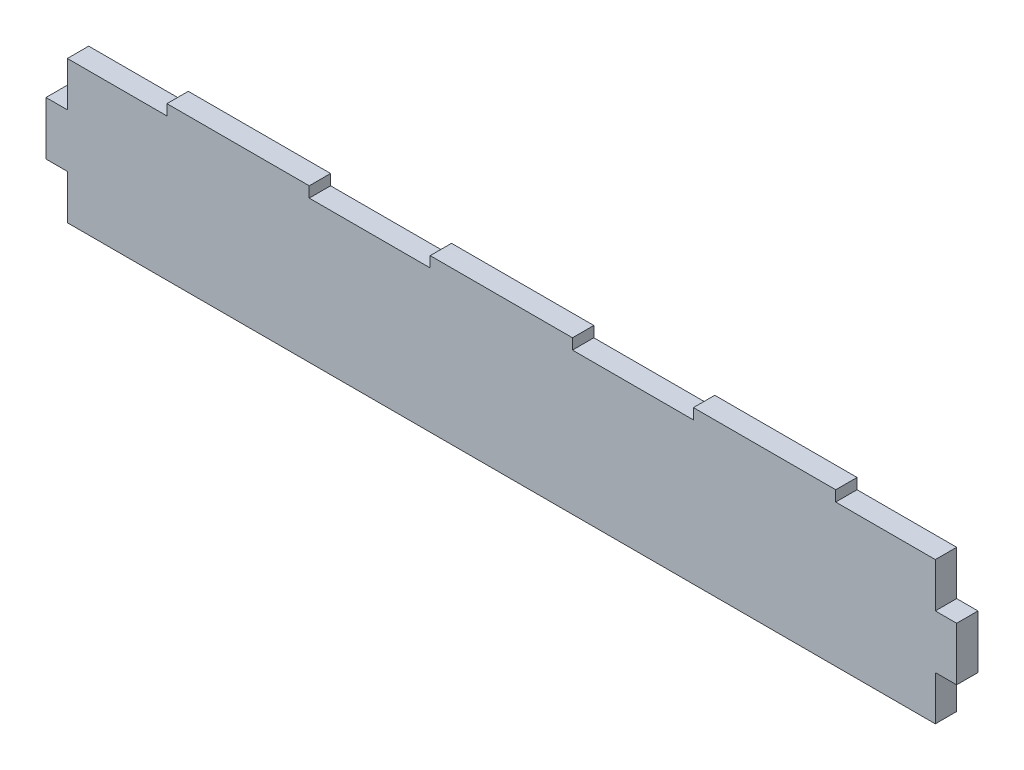
ISO-10303-21;
HEADER;
FILE_DESCRIPTION(('STEP AP214'),'2;1');
FILE_NAME('part.step','',(''),(''),'','','');
FILE_SCHEMA(('AUTOMOTIVE_DESIGN { 1 0 10303 214 1 1 1 1 }'));
ENDSEC;
DATA;
#1=APPLICATION_CONTEXT('core data for automotive mechanical design processes');
#2=APPLICATION_PROTOCOL_DEFINITION('international standard','automotive_design',2000,#1);
#3=PRODUCT_CONTEXT('',#1,'mechanical');
#4=PRODUCT('Part','Part','',(#3));
#5=PRODUCT_RELATED_PRODUCT_CATEGORY('part','',(#4));
#6=PRODUCT_DEFINITION_FORMATION('','',#4);
#7=PRODUCT_DEFINITION_CONTEXT('part definition',#1,'design');
#8=PRODUCT_DEFINITION('design','',#6,#7);
#9=PRODUCT_DEFINITION_SHAPE('','',#8);
#10=(LENGTH_UNIT() NAMED_UNIT(*) SI_UNIT(.MILLI.,.METRE.));
#11=(NAMED_UNIT(*) PLANE_ANGLE_UNIT() SI_UNIT($,.RADIAN.));
#12=(NAMED_UNIT(*) SI_UNIT($,.STERADIAN.) SOLID_ANGLE_UNIT());
#13=UNCERTAINTY_MEASURE_WITH_UNIT(LENGTH_MEASURE(1.E-05),#10,'distance_accuracy_value','');
#14=(GEOMETRIC_REPRESENTATION_CONTEXT(3) GLOBAL_UNCERTAINTY_ASSIGNED_CONTEXT((#13)) GLOBAL_UNIT_ASSIGNED_CONTEXT((#10,
#11,#12)) REPRESENTATION_CONTEXT('',''));
#15=CARTESIAN_POINT('',(0.,0.,0.));
#16=DIRECTION('',(0.,0.,1.));
#17=DIRECTION('',(1.,0.,0.));
#18=AXIS2_PLACEMENT_3D('',#15,#16,#17);
#19=CARTESIAN_POINT('',(0.,0.,6.));
#20=DIRECTION('',(1.,0.,0.));
#21=DIRECTION('',(0.,0.,-1.));
#22=AXIS2_PLACEMENT_3D('',#19,#20,#21);
#23=PLANE('',#22);
#24=DIRECTION('',(0.,-1.,0.));
#25=VECTOR('',#24,1.);
#26=CARTESIAN_POINT('',(0.,0.,0.));
#27=LINE('',#26,#25);
#28=CARTESIAN_POINT('',(0.,12.5,0.));
#29=VERTEX_POINT('',#28);
#30=CARTESIAN_POINT('',(0.,0.,0.));
#31=VERTEX_POINT('',#30);
#32=EDGE_CURVE('E225',#29,#31,#27,.T.);
#33=ORIENTED_EDGE('',*,*,#32,.T.);
#34=DIRECTION('',(0.,0.,-1.));
#35=VECTOR('',#34,1.);
#36=CARTESIAN_POINT('',(0.,0.,6.));
#37=LINE('',#36,#35);
#38=CARTESIAN_POINT('',(0.,0.,6.));
#39=VERTEX_POINT('',#38);
#40=EDGE_CURVE('E11',#39,#31,#37,.T.);
#41=ORIENTED_EDGE('',*,*,#40,.F.);
#42=DIRECTION('',(0.,-1.,0.));
#43=VECTOR('',#42,1.);
#44=CARTESIAN_POINT('',(0.,0.,6.));
#45=LINE('',#44,#43);
#46=CARTESIAN_POINT('',(0.,12.5,6.));
#47=VERTEX_POINT('',#46);
#48=EDGE_CURVE('E271',#47,#39,#45,.T.);
#49=ORIENTED_EDGE('',*,*,#48,.F.);
#50=DIRECTION('',(0.,0.,-1.));
#51=VECTOR('',#50,1.);
#52=CARTESIAN_POINT('',(0.,12.5,6.));
#53=LINE('',#52,#51);
#54=EDGE_CURVE('E221',#47,#29,#53,.T.);
#55=ORIENTED_EDGE('',*,*,#54,.T.);
#56=EDGE_LOOP('',(#33,#41,#49,#55));
#57=FACE_BOUND('',#56,.T.);
#58=ADVANCED_FACE('F33',(#57),#23,.F.);
#59=CARTESIAN_POINT('',(0.,0.,6.));
#60=DIRECTION('',(0.,1.,0.));
#61=DIRECTION('',(0.,0.,1.));
#62=AXIS2_PLACEMENT_3D('',#59,#60,#61);
#63=PLANE('',#62);
#64=DIRECTION('',(1.,0.,0.));
#65=VECTOR('',#64,1.);
#66=CARTESIAN_POINT('',(0.,0.,0.));
#67=LINE('',#66,#65);
#68=CARTESIAN_POINT('',(244.,0.,0.));
#69=VERTEX_POINT('',#68);
#70=EDGE_CURVE('E228',#31,#69,#67,.T.);
#71=ORIENTED_EDGE('',*,*,#70,.T.);
#72=DIRECTION('',(0.,0.,-1.));
#73=VECTOR('',#72,1.);
#74=CARTESIAN_POINT('',(244.,0.,6.));
#75=LINE('',#74,#73);
#76=CARTESIAN_POINT('',(244.,0.,6.));
#77=VERTEX_POINT('',#76);
#78=EDGE_CURVE('E41',#77,#69,#75,.T.);
#79=ORIENTED_EDGE('',*,*,#78,.F.);
#80=DIRECTION('',(1.,0.,0.));
#81=VECTOR('',#80,1.);
#82=CARTESIAN_POINT('',(0.,0.,6.));
#83=LINE('',#82,#81);
#84=EDGE_CURVE('E140',#39,#77,#83,.T.);
#85=ORIENTED_EDGE('',*,*,#84,.F.);
#86=ORIENTED_EDGE('',*,*,#40,.T.);
#87=EDGE_LOOP('',(#71,#79,#85,#86));
#88=FACE_BOUND('',#87,.T.);
#89=ADVANCED_FACE('F409',(#88),#63,.F.);
#90=CARTESIAN_POINT('',(244.,0.,6.));
#91=DIRECTION('',(-1.,0.,0.));
#92=DIRECTION('',(0.,0.,1.));
#93=AXIS2_PLACEMENT_3D('',#90,#91,#92);
#94=PLANE('',#93);
#95=DIRECTION('',(0.,1.,0.));
#96=VECTOR('',#95,1.);
#97=CARTESIAN_POINT('',(244.,0.,0.));
#98=LINE('',#97,#96);
#99=CARTESIAN_POINT('',(244.,12.5,0.));
#100=VERTEX_POINT('',#99);
#101=EDGE_CURVE('E230',#69,#100,#98,.T.);
#102=ORIENTED_EDGE('',*,*,#101,.T.);
#103=DIRECTION('',(0.,0.,-1.));
#104=VECTOR('',#103,1.);
#105=CARTESIAN_POINT('',(244.,12.5,6.));
#106=LINE('',#105,#104);
#107=CARTESIAN_POINT('',(244.,12.5,6.));
#108=VERTEX_POINT('',#107);
#109=EDGE_CURVE('E326',#108,#100,#106,.T.);
#110=ORIENTED_EDGE('',*,*,#109,.F.);
#111=DIRECTION('',(0.,1.,0.));
#112=VECTOR('',#111,1.);
#113=CARTESIAN_POINT('',(244.,0.,6.));
#114=LINE('',#113,#112);
#115=EDGE_CURVE('E334',#77,#108,#114,.T.);
#116=ORIENTED_EDGE('',*,*,#115,.F.);
#117=ORIENTED_EDGE('',*,*,#78,.T.);
#118=EDGE_LOOP('',(#102,#110,#116,#117));
#119=FACE_BOUND('',#118,.T.);
#120=ADVANCED_FACE('F332',(#119),#94,.F.);
#121=CARTESIAN_POINT('',(244.,12.5,6.));
#122=DIRECTION('',(0.,1.,0.));
#123=DIRECTION('',(0.,0.,1.));
#124=AXIS2_PLACEMENT_3D('',#121,#122,#123);
#125=PLANE('',#124);
#126=DIRECTION('',(1.,0.,0.));
#127=VECTOR('',#126,1.);
#128=CARTESIAN_POINT('',(244.,12.5,0.));
#129=LINE('',#128,#127);
#130=CARTESIAN_POINT('',(250.,12.5,0.));
#131=VERTEX_POINT('',#130);
#132=EDGE_CURVE('E232',#100,#131,#129,.T.);
#133=ORIENTED_EDGE('',*,*,#132,.T.);
#134=DIRECTION('',(0.,0.,-1.));
#135=VECTOR('',#134,1.);
#136=CARTESIAN_POINT('',(250.,12.5,6.));
#137=LINE('',#136,#135);
#138=CARTESIAN_POINT('',(250.,12.5,6.));
#139=VERTEX_POINT('',#138);
#140=EDGE_CURVE('E323',#139,#131,#137,.T.);
#141=ORIENTED_EDGE('',*,*,#140,.F.);
#142=DIRECTION('',(1.,0.,0.));
#143=VECTOR('',#142,1.);
#144=CARTESIAN_POINT('',(244.,12.5,6.));
#145=LINE('',#144,#143);
#146=EDGE_CURVE('E352',#108,#139,#145,.T.);
#147=ORIENTED_EDGE('',*,*,#146,.F.);
#148=ORIENTED_EDGE('',*,*,#109,.T.);
#149=EDGE_LOOP('',(#133,#141,#147,#148));
#150=FACE_BOUND('',#149,.T.);
#151=ADVANCED_FACE('F343',(#150),#125,.F.);
#152=CARTESIAN_POINT('',(250.,27.5,6.));
#153=DIRECTION('',(-1.,0.,0.));
#154=DIRECTION('',(0.,0.,1.));
#155=AXIS2_PLACEMENT_3D('',#152,#153,#154);
#156=PLANE('',#155);
#157=DIRECTION('',(0.,1.,0.));
#158=VECTOR('',#157,1.);
#159=CARTESIAN_POINT('',(250.,27.5,0.));
#160=LINE('',#159,#158);
#161=CARTESIAN_POINT('',(250.,27.5,0.));
#162=VERTEX_POINT('',#161);
#163=EDGE_CURVE('E234',#131,#162,#160,.T.);
#164=ORIENTED_EDGE('',*,*,#163,.T.);
#165=DIRECTION('',(0.,0.,-1.));
#166=VECTOR('',#165,1.);
#167=CARTESIAN_POINT('',(250.,27.5,6.));
#168=LINE('',#167,#166);
#169=CARTESIAN_POINT('',(250.,27.5,6.));
#170=VERTEX_POINT('',#169);
#171=EDGE_CURVE('E320',#170,#162,#168,.T.);
#172=ORIENTED_EDGE('',*,*,#171,.F.);
#173=DIRECTION('',(0.,1.,0.));
#174=VECTOR('',#173,1.);
#175=CARTESIAN_POINT('',(250.,27.5,6.));
#176=LINE('',#175,#174);
#177=EDGE_CURVE('E349',#139,#170,#176,.T.);
#178=ORIENTED_EDGE('',*,*,#177,.F.);
#179=ORIENTED_EDGE('',*,*,#140,.T.);
#180=EDGE_LOOP('',(#164,#172,#178,#179));
#181=FACE_BOUND('',#180,.T.);
#182=ADVANCED_FACE('F347',(#181),#156,.F.);
#183=CARTESIAN_POINT('',(244.,27.5,6.));
#184=DIRECTION('',(0.,-1.,0.));
#185=DIRECTION('',(0.,0.,-1.));
#186=AXIS2_PLACEMENT_3D('',#183,#184,#185);
#187=PLANE('',#186);
#188=DIRECTION('',(-1.,0.,0.));
#189=VECTOR('',#188,1.);
#190=CARTESIAN_POINT('',(244.,27.5,0.));
#191=LINE('',#190,#189);
#192=CARTESIAN_POINT('',(244.,27.5,0.));
#193=VERTEX_POINT('',#192);
#194=EDGE_CURVE('E236',#162,#193,#191,.T.);
#195=ORIENTED_EDGE('',*,*,#194,.T.);
#196=DIRECTION('',(0.,0.,-1.));
#197=VECTOR('',#196,1.);
#198=CARTESIAN_POINT('',(244.,27.5,6.));
#199=LINE('',#198,#197);
#200=CARTESIAN_POINT('',(244.,27.5,6.));
#201=VERTEX_POINT('',#200);
#202=EDGE_CURVE('E317',#201,#193,#199,.T.);
#203=ORIENTED_EDGE('',*,*,#202,.F.);
#204=DIRECTION('',(-1.,0.,0.));
#205=VECTOR('',#204,1.);
#206=CARTESIAN_POINT('',(244.,27.5,6.));
#207=LINE('',#206,#205);
#208=EDGE_CURVE('E351',#170,#201,#207,.T.);
#209=ORIENTED_EDGE('',*,*,#208,.F.);
#210=ORIENTED_EDGE('',*,*,#171,.T.);
#211=EDGE_LOOP('',(#195,#203,#209,#210));
#212=FACE_BOUND('',#211,.T.);
#213=ADVANCED_FACE('F422',(#212),#187,.F.);
#214=CARTESIAN_POINT('',(244.,27.5,6.));
#215=DIRECTION('',(-1.,0.,0.));
#216=DIRECTION('',(0.,0.,1.));
#217=AXIS2_PLACEMENT_3D('',#214,#215,#216);
#218=PLANE('',#217);
#219=DIRECTION('',(0.,1.,0.));
#220=VECTOR('',#219,1.);
#221=CARTESIAN_POINT('',(244.,27.5,0.));
#222=LINE('',#221,#220);
#223=CARTESIAN_POINT('',(244.,40.,0.));
#224=VERTEX_POINT('',#223);
#225=EDGE_CURVE('E238',#193,#224,#222,.T.);
#226=ORIENTED_EDGE('',*,*,#225,.T.);
#227=DIRECTION('',(0.,0.,-1.));
#228=VECTOR('',#227,1.);
#229=CARTESIAN_POINT('',(244.,40.,6.));
#230=LINE('',#229,#228);
#231=CARTESIAN_POINT('',(244.,40.,6.));
#232=VERTEX_POINT('',#231);
#233=EDGE_CURVE('E314',#232,#224,#230,.T.);
#234=ORIENTED_EDGE('',*,*,#233,.F.);
#235=DIRECTION('',(0.,1.,0.));
#236=VECTOR('',#235,1.);
#237=CARTESIAN_POINT('',(244.,27.5,6.));
#238=LINE('',#237,#236);
#239=EDGE_CURVE('E354',#201,#232,#238,.T.);
#240=ORIENTED_EDGE('',*,*,#239,.F.);
#241=ORIENTED_EDGE('',*,*,#202,.T.);
#242=EDGE_LOOP('',(#226,#234,#240,#241));
#243=FACE_BOUND('',#242,.T.);
#244=ADVANCED_FACE('F425',(#243),#218,.F.);
#245=CARTESIAN_POINT('',(216.,40.,6.));
#246=DIRECTION('',(0.,-1.,0.));
#247=DIRECTION('',(0.,0.,-1.));
#248=AXIS2_PLACEMENT_3D('',#245,#246,#247);
#249=PLANE('',#248);
#250=DIRECTION('',(-1.,0.,0.));
#251=VECTOR('',#250,1.);
#252=CARTESIAN_POINT('',(216.,40.,0.));
#253=LINE('',#252,#251);
#254=CARTESIAN_POINT('',(216.,40.,0.));
#255=VERTEX_POINT('',#254);
#256=EDGE_CURVE('E240',#224,#255,#253,.T.);
#257=ORIENTED_EDGE('',*,*,#256,.T.);
#258=DIRECTION('',(0.,0.,-1.));
#259=VECTOR('',#258,1.);
#260=CARTESIAN_POINT('',(216.,40.,6.));
#261=LINE('',#260,#259);
#262=CARTESIAN_POINT('',(216.,40.,6.));
#263=VERTEX_POINT('',#262);
#264=EDGE_CURVE('E311',#263,#255,#261,.T.);
#265=ORIENTED_EDGE('',*,*,#264,.F.);
#266=DIRECTION('',(-1.,0.,0.));
#267=VECTOR('',#266,1.);
#268=CARTESIAN_POINT('',(216.,40.,6.));
#269=LINE('',#268,#267);
#270=EDGE_CURVE('E360',#232,#263,#269,.T.);
#271=ORIENTED_EDGE('',*,*,#270,.F.);
#272=ORIENTED_EDGE('',*,*,#233,.T.);
#273=EDGE_LOOP('',(#257,#265,#271,#272));
#274=FACE_BOUND('',#273,.T.);
#275=ADVANCED_FACE('F429',(#274),#249,.F.);
#276=CARTESIAN_POINT('',(216.,40.,6.));
#277=DIRECTION('',(-1.,0.,0.));
#278=DIRECTION('',(0.,0.,1.));
#279=AXIS2_PLACEMENT_3D('',#276,#277,#278);
#280=PLANE('',#279);
#281=DIRECTION('',(0.,1.,0.));
#282=VECTOR('',#281,1.);
#283=CARTESIAN_POINT('',(216.,40.,0.));
#284=LINE('',#283,#282);
#285=CARTESIAN_POINT('',(216.,43.,0.));
#286=VERTEX_POINT('',#285);
#287=EDGE_CURVE('E242',#255,#286,#284,.T.);
#288=ORIENTED_EDGE('',*,*,#287,.T.);
#289=DIRECTION('',(0.,0.,-1.));
#290=VECTOR('',#289,1.);
#291=CARTESIAN_POINT('',(216.,43.,6.));
#292=LINE('',#291,#290);
#293=CARTESIAN_POINT('',(216.,43.,6.));
#294=VERTEX_POINT('',#293);
#295=EDGE_CURVE('E308',#294,#286,#292,.T.);
#296=ORIENTED_EDGE('',*,*,#295,.F.);
#297=DIRECTION('',(0.,1.,0.));
#298=VECTOR('',#297,1.);
#299=CARTESIAN_POINT('',(216.,40.,6.));
#300=LINE('',#299,#298);
#301=EDGE_CURVE('E362',#263,#294,#300,.T.);
#302=ORIENTED_EDGE('',*,*,#301,.F.);
#303=ORIENTED_EDGE('',*,*,#264,.T.);
#304=EDGE_LOOP('',(#288,#296,#302,#303));
#305=FACE_BOUND('',#304,.T.);
#306=ADVANCED_FACE('F433',(#305),#280,.F.);
#307=CARTESIAN_POINT('',(176.,43.,6.));
#308=DIRECTION('',(0.,-1.,0.));
#309=DIRECTION('',(0.,0.,-1.));
#310=AXIS2_PLACEMENT_3D('',#307,#308,#309);
#311=PLANE('',#310);
#312=DIRECTION('',(-1.,0.,0.));
#313=VECTOR('',#312,1.);
#314=CARTESIAN_POINT('',(176.,43.,0.));
#315=LINE('',#314,#313);
#316=CARTESIAN_POINT('',(176.,43.,0.));
#317=VERTEX_POINT('',#316);
#318=EDGE_CURVE('E244',#286,#317,#315,.T.);
#319=ORIENTED_EDGE('',*,*,#318,.T.);
#320=DIRECTION('',(0.,0.,-1.));
#321=VECTOR('',#320,1.);
#322=CARTESIAN_POINT('',(176.,43.,6.));
#323=LINE('',#322,#321);
#324=CARTESIAN_POINT('',(176.,43.,6.));
#325=VERTEX_POINT('',#324);
#326=EDGE_CURVE('E305',#325,#317,#323,.T.);
#327=ORIENTED_EDGE('',*,*,#326,.F.);
#328=DIRECTION('',(-1.,0.,0.));
#329=VECTOR('',#328,1.);
#330=CARTESIAN_POINT('',(176.,43.,6.));
#331=LINE('',#330,#329);
#332=EDGE_CURVE('E364',#294,#325,#331,.T.);
#333=ORIENTED_EDGE('',*,*,#332,.F.);
#334=ORIENTED_EDGE('',*,*,#295,.T.);
#335=EDGE_LOOP('',(#319,#327,#333,#334));
#336=FACE_BOUND('',#335,.T.);
#337=ADVANCED_FACE('F437',(#336),#311,.F.);
#338=CARTESIAN_POINT('',(176.,40.,6.));
#339=DIRECTION('',(1.,0.,0.));
#340=DIRECTION('',(0.,0.,-1.));
#341=AXIS2_PLACEMENT_3D('',#338,#339,#340);
#342=PLANE('',#341);
#343=DIRECTION('',(0.,-1.,0.));
#344=VECTOR('',#343,1.);
#345=CARTESIAN_POINT('',(176.,40.,0.));
#346=LINE('',#345,#344);
#347=CARTESIAN_POINT('',(176.,40.,0.));
#348=VERTEX_POINT('',#347);
#349=EDGE_CURVE('E246',#317,#348,#346,.T.);
#350=ORIENTED_EDGE('',*,*,#349,.T.);
#351=DIRECTION('',(0.,0.,-1.));
#352=VECTOR('',#351,1.);
#353=CARTESIAN_POINT('',(176.,40.,6.));
#354=LINE('',#353,#352);
#355=CARTESIAN_POINT('',(176.,40.,6.));
#356=VERTEX_POINT('',#355);
#357=EDGE_CURVE('E302',#356,#348,#354,.T.);
#358=ORIENTED_EDGE('',*,*,#357,.F.);
#359=DIRECTION('',(0.,-1.,0.));
#360=VECTOR('',#359,1.);
#361=CARTESIAN_POINT('',(176.,40.,6.));
#362=LINE('',#361,#360);
#363=EDGE_CURVE('E366',#325,#356,#362,.T.);
#364=ORIENTED_EDGE('',*,*,#363,.F.);
#365=ORIENTED_EDGE('',*,*,#326,.T.);
#366=EDGE_LOOP('',(#350,#358,#364,#365));
#367=FACE_BOUND('',#366,.T.);
#368=ADVANCED_FACE('F441',(#367),#342,.F.);
#369=CARTESIAN_POINT('',(142.,40.,6.));
#370=DIRECTION('',(0.,-1.,0.));
#371=DIRECTION('',(0.,0.,-1.));
#372=AXIS2_PLACEMENT_3D('',#369,#370,#371);
#373=PLANE('',#372);
#374=DIRECTION('',(-1.,0.,0.));
#375=VECTOR('',#374,1.);
#376=CARTESIAN_POINT('',(142.,40.,0.));
#377=LINE('',#376,#375);
#378=CARTESIAN_POINT('',(142.,40.,0.));
#379=VERTEX_POINT('',#378);
#380=EDGE_CURVE('E248',#348,#379,#377,.T.);
#381=ORIENTED_EDGE('',*,*,#380,.T.);
#382=DIRECTION('',(0.,0.,-1.));
#383=VECTOR('',#382,1.);
#384=CARTESIAN_POINT('',(142.,40.,6.));
#385=LINE('',#384,#383);
#386=CARTESIAN_POINT('',(142.,40.,6.));
#387=VERTEX_POINT('',#386);
#388=EDGE_CURVE('E299',#387,#379,#385,.T.);
#389=ORIENTED_EDGE('',*,*,#388,.F.);
#390=DIRECTION('',(-1.,0.,0.));
#391=VECTOR('',#390,1.);
#392=CARTESIAN_POINT('',(142.,40.,6.));
#393=LINE('',#392,#391);
#394=EDGE_CURVE('E368',#356,#387,#393,.T.);
#395=ORIENTED_EDGE('',*,*,#394,.F.);
#396=ORIENTED_EDGE('',*,*,#357,.T.);
#397=EDGE_LOOP('',(#381,#389,#395,#396));
#398=FACE_BOUND('',#397,.T.);
#399=ADVANCED_FACE('F445',(#398),#373,.F.);
#400=CARTESIAN_POINT('',(142.,40.,6.));
#401=DIRECTION('',(-1.,0.,0.));
#402=DIRECTION('',(0.,0.,1.));
#403=AXIS2_PLACEMENT_3D('',#400,#401,#402);
#404=PLANE('',#403);
#405=DIRECTION('',(0.,1.,0.));
#406=VECTOR('',#405,1.);
#407=CARTESIAN_POINT('',(142.,40.,0.));
#408=LINE('',#407,#406);
#409=CARTESIAN_POINT('',(142.,43.,0.));
#410=VERTEX_POINT('',#409);
#411=EDGE_CURVE('E250',#379,#410,#408,.T.);
#412=ORIENTED_EDGE('',*,*,#411,.T.);
#413=DIRECTION('',(0.,0.,-1.));
#414=VECTOR('',#413,1.);
#415=CARTESIAN_POINT('',(142.,43.,6.));
#416=LINE('',#415,#414);
#417=CARTESIAN_POINT('',(142.,43.,6.));
#418=VERTEX_POINT('',#417);
#419=EDGE_CURVE('E296',#418,#410,#416,.T.);
#420=ORIENTED_EDGE('',*,*,#419,.F.);
#421=DIRECTION('',(0.,1.,0.));
#422=VECTOR('',#421,1.);
#423=CARTESIAN_POINT('',(142.,40.,6.));
#424=LINE('',#423,#422);
#425=EDGE_CURVE('E370',#387,#418,#424,.T.);
#426=ORIENTED_EDGE('',*,*,#425,.F.);
#427=ORIENTED_EDGE('',*,*,#388,.T.);
#428=EDGE_LOOP('',(#412,#420,#426,#427));
#429=FACE_BOUND('',#428,.T.);
#430=ADVANCED_FACE('F449',(#429),#404,.F.);
#431=CARTESIAN_POINT('',(102.,43.,6.));
#432=DIRECTION('',(0.,-1.,0.));
#433=DIRECTION('',(0.,0.,-1.));
#434=AXIS2_PLACEMENT_3D('',#431,#432,#433);
#435=PLANE('',#434);
#436=DIRECTION('',(-1.,0.,0.));
#437=VECTOR('',#436,1.);
#438=CARTESIAN_POINT('',(102.,43.,0.));
#439=LINE('',#438,#437);
#440=CARTESIAN_POINT('',(102.,43.,0.));
#441=VERTEX_POINT('',#440);
#442=EDGE_CURVE('E252',#410,#441,#439,.T.);
#443=ORIENTED_EDGE('',*,*,#442,.T.);
#444=DIRECTION('',(0.,0.,-1.));
#445=VECTOR('',#444,1.);
#446=CARTESIAN_POINT('',(102.,43.,6.));
#447=LINE('',#446,#445);
#448=CARTESIAN_POINT('',(102.,43.,6.));
#449=VERTEX_POINT('',#448);
#450=EDGE_CURVE('E293',#449,#441,#447,.T.);
#451=ORIENTED_EDGE('',*,*,#450,.F.);
#452=DIRECTION('',(-1.,0.,0.));
#453=VECTOR('',#452,1.);
#454=CARTESIAN_POINT('',(102.,43.,6.));
#455=LINE('',#454,#453);
#456=EDGE_CURVE('E372',#418,#449,#455,.T.);
#457=ORIENTED_EDGE('',*,*,#456,.F.);
#458=ORIENTED_EDGE('',*,*,#419,.T.);
#459=EDGE_LOOP('',(#443,#451,#457,#458));
#460=FACE_BOUND('',#459,.T.);
#461=ADVANCED_FACE('F453',(#460),#435,.F.);
#462=CARTESIAN_POINT('',(102.,40.,6.));
#463=DIRECTION('',(1.,0.,0.));
#464=DIRECTION('',(0.,0.,-1.));
#465=AXIS2_PLACEMENT_3D('',#462,#463,#464);
#466=PLANE('',#465);
#467=DIRECTION('',(0.,-1.,0.));
#468=VECTOR('',#467,1.);
#469=CARTESIAN_POINT('',(102.,40.,0.));
#470=LINE('',#469,#468);
#471=CARTESIAN_POINT('',(102.,40.,0.));
#472=VERTEX_POINT('',#471);
#473=EDGE_CURVE('E254',#441,#472,#470,.T.);
#474=ORIENTED_EDGE('',*,*,#473,.T.);
#475=DIRECTION('',(0.,0.,-1.));
#476=VECTOR('',#475,1.);
#477=CARTESIAN_POINT('',(102.,40.,6.));
#478=LINE('',#477,#476);
#479=CARTESIAN_POINT('',(102.,40.,6.));
#480=VERTEX_POINT('',#479);
#481=EDGE_CURVE('E290',#480,#472,#478,.T.);
#482=ORIENTED_EDGE('',*,*,#481,.F.);
#483=DIRECTION('',(0.,-1.,0.));
#484=VECTOR('',#483,1.);
#485=CARTESIAN_POINT('',(102.,40.,6.));
#486=LINE('',#485,#484);
#487=EDGE_CURVE('E374',#449,#480,#486,.T.);
#488=ORIENTED_EDGE('',*,*,#487,.F.);
#489=ORIENTED_EDGE('',*,*,#450,.T.);
#490=EDGE_LOOP('',(#474,#482,#488,#489));
#491=FACE_BOUND('',#490,.T.);
#492=ADVANCED_FACE('F457',(#491),#466,.F.);
#493=CARTESIAN_POINT('',(68.,40.,6.));
#494=DIRECTION('',(0.,-1.,0.));
#495=DIRECTION('',(0.,0.,-1.));
#496=AXIS2_PLACEMENT_3D('',#493,#494,#495);
#497=PLANE('',#496);
#498=DIRECTION('',(-1.,0.,0.));
#499=VECTOR('',#498,1.);
#500=CARTESIAN_POINT('',(68.,40.,0.));
#501=LINE('',#500,#499);
#502=CARTESIAN_POINT('',(68.,40.,0.));
#503=VERTEX_POINT('',#502);
#504=EDGE_CURVE('E256',#472,#503,#501,.T.);
#505=ORIENTED_EDGE('',*,*,#504,.T.);
#506=DIRECTION('',(0.,0.,-1.));
#507=VECTOR('',#506,1.);
#508=CARTESIAN_POINT('',(68.,40.,6.));
#509=LINE('',#508,#507);
#510=CARTESIAN_POINT('',(68.,40.,6.));
#511=VERTEX_POINT('',#510);
#512=EDGE_CURVE('E287',#511,#503,#509,.T.);
#513=ORIENTED_EDGE('',*,*,#512,.F.);
#514=DIRECTION('',(-1.,0.,0.));
#515=VECTOR('',#514,1.);
#516=CARTESIAN_POINT('',(68.,40.,6.));
#517=LINE('',#516,#515);
#518=EDGE_CURVE('E376',#480,#511,#517,.T.);
#519=ORIENTED_EDGE('',*,*,#518,.F.);
#520=ORIENTED_EDGE('',*,*,#481,.T.);
#521=EDGE_LOOP('',(#505,#513,#519,#520));
#522=FACE_BOUND('',#521,.T.);
#523=ADVANCED_FACE('F461',(#522),#497,.F.);
#524=CARTESIAN_POINT('',(68.,40.,6.));
#525=DIRECTION('',(-1.,0.,0.));
#526=DIRECTION('',(0.,0.,1.));
#527=AXIS2_PLACEMENT_3D('',#524,#525,#526);
#528=PLANE('',#527);
#529=DIRECTION('',(0.,1.,0.));
#530=VECTOR('',#529,1.);
#531=CARTESIAN_POINT('',(68.,40.,0.));
#532=LINE('',#531,#530);
#533=CARTESIAN_POINT('',(68.,43.,0.));
#534=VERTEX_POINT('',#533);
#535=EDGE_CURVE('E258',#503,#534,#532,.T.);
#536=ORIENTED_EDGE('',*,*,#535,.T.);
#537=DIRECTION('',(0.,0.,-1.));
#538=VECTOR('',#537,1.);
#539=CARTESIAN_POINT('',(68.,43.,6.));
#540=LINE('',#539,#538);
#541=CARTESIAN_POINT('',(68.,43.,6.));
#542=VERTEX_POINT('',#541);
#543=EDGE_CURVE('E284',#542,#534,#540,.T.);
#544=ORIENTED_EDGE('',*,*,#543,.F.);
#545=DIRECTION('',(0.,1.,0.));
#546=VECTOR('',#545,1.);
#547=CARTESIAN_POINT('',(68.,40.,6.));
#548=LINE('',#547,#546);
#549=EDGE_CURVE('E378',#511,#542,#548,.T.);
#550=ORIENTED_EDGE('',*,*,#549,.F.);
#551=ORIENTED_EDGE('',*,*,#512,.T.);
#552=EDGE_LOOP('',(#536,#544,#550,#551));
#553=FACE_BOUND('',#552,.T.);
#554=ADVANCED_FACE('F465',(#553),#528,.F.);
#555=CARTESIAN_POINT('',(28.,43.,6.));
#556=DIRECTION('',(0.,-1.,0.));
#557=DIRECTION('',(0.,0.,-1.));
#558=AXIS2_PLACEMENT_3D('',#555,#556,#557);
#559=PLANE('',#558);
#560=DIRECTION('',(-1.,0.,0.));
#561=VECTOR('',#560,1.);
#562=CARTESIAN_POINT('',(28.,43.,0.));
#563=LINE('',#562,#561);
#564=CARTESIAN_POINT('',(28.,43.,0.));
#565=VERTEX_POINT('',#564);
#566=EDGE_CURVE('E260',#534,#565,#563,.T.);
#567=ORIENTED_EDGE('',*,*,#566,.T.);
#568=DIRECTION('',(0.,0.,-1.));
#569=VECTOR('',#568,1.);
#570=CARTESIAN_POINT('',(28.,43.,6.));
#571=LINE('',#570,#569);
#572=CARTESIAN_POINT('',(28.,43.,6.));
#573=VERTEX_POINT('',#572);
#574=EDGE_CURVE('E281',#573,#565,#571,.T.);
#575=ORIENTED_EDGE('',*,*,#574,.F.);
#576=DIRECTION('',(-1.,0.,0.));
#577=VECTOR('',#576,1.);
#578=CARTESIAN_POINT('',(28.,43.,6.));
#579=LINE('',#578,#577);
#580=EDGE_CURVE('E380',#542,#573,#579,.T.);
#581=ORIENTED_EDGE('',*,*,#580,.F.);
#582=ORIENTED_EDGE('',*,*,#543,.T.);
#583=EDGE_LOOP('',(#567,#575,#581,#582));
#584=FACE_BOUND('',#583,.T.);
#585=ADVANCED_FACE('F469',(#584),#559,.F.);
#586=CARTESIAN_POINT('',(28.,40.,6.));
#587=DIRECTION('',(1.,0.,0.));
#588=DIRECTION('',(0.,0.,-1.));
#589=AXIS2_PLACEMENT_3D('',#586,#587,#588);
#590=PLANE('',#589);
#591=DIRECTION('',(0.,-1.,0.));
#592=VECTOR('',#591,1.);
#593=CARTESIAN_POINT('',(28.,40.,0.));
#594=LINE('',#593,#592);
#595=CARTESIAN_POINT('',(28.,40.,0.));
#596=VERTEX_POINT('',#595);
#597=EDGE_CURVE('E262',#565,#596,#594,.T.);
#598=ORIENTED_EDGE('',*,*,#597,.T.);
#599=DIRECTION('',(0.,0.,-1.));
#600=VECTOR('',#599,1.);
#601=CARTESIAN_POINT('',(28.,40.,6.));
#602=LINE('',#601,#600);
#603=CARTESIAN_POINT('',(28.,40.,6.));
#604=VERTEX_POINT('',#603);
#605=EDGE_CURVE('E278',#604,#596,#602,.T.);
#606=ORIENTED_EDGE('',*,*,#605,.F.);
#607=DIRECTION('',(0.,-1.,0.));
#608=VECTOR('',#607,1.);
#609=CARTESIAN_POINT('',(28.,40.,6.));
#610=LINE('',#609,#608);
#611=EDGE_CURVE('E382',#573,#604,#610,.T.);
#612=ORIENTED_EDGE('',*,*,#611,.F.);
#613=ORIENTED_EDGE('',*,*,#574,.T.);
#614=EDGE_LOOP('',(#598,#606,#612,#613));
#615=FACE_BOUND('',#614,.T.);
#616=ADVANCED_FACE('F473',(#615),#590,.F.);
#617=CARTESIAN_POINT('',(0.,40.,6.));
#618=DIRECTION('',(0.,-1.,0.));
#619=DIRECTION('',(0.,0.,-1.));
#620=AXIS2_PLACEMENT_3D('',#617,#618,#619);
#621=PLANE('',#620);
#622=DIRECTION('',(-1.,0.,0.));
#623=VECTOR('',#622,1.);
#624=CARTESIAN_POINT('',(0.,40.,0.));
#625=LINE('',#624,#623);
#626=CARTESIAN_POINT('',(0.,40.,0.));
#627=VERTEX_POINT('',#626);
#628=EDGE_CURVE('E264',#596,#627,#625,.T.);
#629=ORIENTED_EDGE('',*,*,#628,.T.);
#630=DIRECTION('',(0.,0.,-1.));
#631=VECTOR('',#630,1.);
#632=CARTESIAN_POINT('',(0.,40.,6.));
#633=LINE('',#632,#631);
#634=CARTESIAN_POINT('',(0.,40.,6.));
#635=VERTEX_POINT('',#634);
#636=EDGE_CURVE('E275',#635,#627,#633,.T.);
#637=ORIENTED_EDGE('',*,*,#636,.F.);
#638=DIRECTION('',(-1.,0.,0.));
#639=VECTOR('',#638,1.);
#640=CARTESIAN_POINT('',(0.,40.,6.));
#641=LINE('',#640,#639);
#642=EDGE_CURVE('E384',#604,#635,#641,.T.);
#643=ORIENTED_EDGE('',*,*,#642,.F.);
#644=ORIENTED_EDGE('',*,*,#605,.T.);
#645=EDGE_LOOP('',(#629,#637,#643,#644));
#646=FACE_BOUND('',#645,.T.);
#647=ADVANCED_FACE('F390',(#646),#621,.F.);
#648=CARTESIAN_POINT('',(0.,27.5,6.));
#649=DIRECTION('',(1.,0.,0.));
#650=DIRECTION('',(0.,0.,-1.));
#651=AXIS2_PLACEMENT_3D('',#648,#649,#650);
#652=PLANE('',#651);
#653=DIRECTION('',(0.,-1.,0.));
#654=VECTOR('',#653,1.);
#655=CARTESIAN_POINT('',(0.,27.5,0.));
#656=LINE('',#655,#654);
#657=CARTESIAN_POINT('',(0.,27.5,0.));
#658=VERTEX_POINT('',#657);
#659=EDGE_CURVE('E266',#627,#658,#656,.T.);
#660=ORIENTED_EDGE('',*,*,#659,.T.);
#661=DIRECTION('',(0.,0.,-1.));
#662=VECTOR('',#661,1.);
#663=CARTESIAN_POINT('',(0.,27.5,6.));
#664=LINE('',#663,#662);
#665=CARTESIAN_POINT('',(0.,27.5,6.));
#666=VERTEX_POINT('',#665);
#667=EDGE_CURVE('E216',#666,#658,#664,.T.);
#668=ORIENTED_EDGE('',*,*,#667,.F.);
#669=DIRECTION('',(0.,-1.,0.));
#670=VECTOR('',#669,1.);
#671=CARTESIAN_POINT('',(0.,27.5,6.));
#672=LINE('',#671,#670);
#673=EDGE_CURVE('E207',#635,#666,#672,.T.);
#674=ORIENTED_EDGE('',*,*,#673,.F.);
#675=ORIENTED_EDGE('',*,*,#636,.T.);
#676=EDGE_LOOP('',(#660,#668,#674,#675));
#677=FACE_BOUND('',#676,.T.);
#678=ADVANCED_FACE('F394',(#677),#652,.F.);
#679=CARTESIAN_POINT('',(0.,27.5,6.));
#680=DIRECTION('',(0.,-1.,0.));
#681=DIRECTION('',(0.,0.,-1.));
#682=AXIS2_PLACEMENT_3D('',#679,#680,#681);
#683=PLANE('',#682);
#684=DIRECTION('',(-1.,0.,0.));
#685=VECTOR('',#684,1.);
#686=CARTESIAN_POINT('',(0.,27.5,0.));
#687=LINE('',#686,#685);
#688=CARTESIAN_POINT('',(-6.,27.5,0.));
#689=VERTEX_POINT('',#688);
#690=EDGE_CURVE('E215',#658,#689,#687,.T.);
#691=ORIENTED_EDGE('',*,*,#690,.T.);
#692=DIRECTION('',(0.,0.,-1.));
#693=VECTOR('',#692,1.);
#694=CARTESIAN_POINT('',(-6.,27.5,6.));
#695=LINE('',#694,#693);
#696=CARTESIAN_POINT('',(-6.,27.5,6.));
#697=VERTEX_POINT('',#696);
#698=EDGE_CURVE('E212',#697,#689,#695,.T.);
#699=ORIENTED_EDGE('',*,*,#698,.F.);
#700=DIRECTION('',(-1.,0.,0.));
#701=VECTOR('',#700,1.);
#702=CARTESIAN_POINT('',(0.,27.5,6.));
#703=LINE('',#702,#701);
#704=EDGE_CURVE('E201',#666,#697,#703,.T.);
#705=ORIENTED_EDGE('',*,*,#704,.F.);
#706=ORIENTED_EDGE('',*,*,#667,.T.);
#707=EDGE_LOOP('',(#691,#699,#705,#706));
#708=FACE_BOUND('',#707,.T.);
#709=ADVANCED_FACE('F213',(#708),#683,.F.);
#710=CARTESIAN_POINT('',(-6.,27.5,6.));
#711=DIRECTION('',(1.,0.,0.));
#712=DIRECTION('',(0.,1.,0.));
#713=AXIS2_PLACEMENT_3D('',#710,#711,#712);
#714=PLANE('',#713);
#715=DIRECTION('',(0.,-1.,0.));
#716=VECTOR('',#715,1.);
#717=CARTESIAN_POINT('',(-6.,27.5,0.));
#718=LINE('',#717,#716);
#719=CARTESIAN_POINT('',(-6.,12.5,0.));
#720=VERTEX_POINT('',#719);
#721=EDGE_CURVE('E126',#689,#720,#718,.T.);
#722=ORIENTED_EDGE('',*,*,#721,.T.);
#723=DIRECTION('',(0.,0.,-1.));
#724=VECTOR('',#723,1.);
#725=CARTESIAN_POINT('',(-6.,12.5,6.));
#726=LINE('',#725,#724);
#727=CARTESIAN_POINT('',(-6.,12.5,6.));
#728=VERTEX_POINT('',#727);
#729=EDGE_CURVE('E217',#728,#720,#726,.T.);
#730=ORIENTED_EDGE('',*,*,#729,.F.);
#731=DIRECTION('',(0.,-1.,0.));
#732=VECTOR('',#731,1.);
#733=CARTESIAN_POINT('',(-6.,27.5,6.));
#734=LINE('',#733,#732);
#735=EDGE_CURVE('E205',#697,#728,#734,.T.);
#736=ORIENTED_EDGE('',*,*,#735,.F.);
#737=ORIENTED_EDGE('',*,*,#698,.T.);
#738=EDGE_LOOP('',(#722,#730,#736,#737));
#739=FACE_BOUND('',#738,.T.);
#740=ADVANCED_FACE('F219',(#739),#714,.F.);
#741=CARTESIAN_POINT('',(0.,12.5,6.));
#742=DIRECTION('',(0.,1.,0.));
#743=DIRECTION('',(0.,0.,1.));
#744=AXIS2_PLACEMENT_3D('',#741,#742,#743);
#745=PLANE('',#744);
#746=DIRECTION('',(1.,0.,0.));
#747=VECTOR('',#746,1.);
#748=CARTESIAN_POINT('',(0.,12.5,0.));
#749=LINE('',#748,#747);
#750=EDGE_CURVE('E132',#720,#29,#749,.T.);
#751=ORIENTED_EDGE('',*,*,#750,.T.);
#752=ORIENTED_EDGE('',*,*,#54,.F.);
#753=DIRECTION('',(1.,0.,0.));
#754=VECTOR('',#753,1.);
#755=CARTESIAN_POINT('',(0.,12.5,6.));
#756=LINE('',#755,#754);
#757=EDGE_CURVE('E49',#728,#47,#756,.T.);
#758=ORIENTED_EDGE('',*,*,#757,.F.);
#759=ORIENTED_EDGE('',*,*,#729,.T.);
#760=EDGE_LOOP('',(#751,#752,#758,#759));
#761=FACE_BOUND('',#760,.T.);
#762=ADVANCED_FACE('F398',(#761),#745,.F.);
#763=CARTESIAN_POINT('',(0.,0.,6.));
#764=DIRECTION('',(0.,0.,1.));
#765=DIRECTION('',(1.,0.,0.));
#766=AXIS2_PLACEMENT_3D('',#763,#764,#765);
#767=PLANE('',#766);
#768=ORIENTED_EDGE('',*,*,#48,.T.);
#769=ORIENTED_EDGE('',*,*,#84,.T.);
#770=ORIENTED_EDGE('',*,*,#115,.T.);
#771=ORIENTED_EDGE('',*,*,#146,.T.);
#772=ORIENTED_EDGE('',*,*,#177,.T.);
#773=ORIENTED_EDGE('',*,*,#208,.T.);
#774=ORIENTED_EDGE('',*,*,#239,.T.);
#775=ORIENTED_EDGE('',*,*,#270,.T.);
#776=ORIENTED_EDGE('',*,*,#301,.T.);
#777=ORIENTED_EDGE('',*,*,#332,.T.);
#778=ORIENTED_EDGE('',*,*,#363,.T.);
#779=ORIENTED_EDGE('',*,*,#394,.T.);
#780=ORIENTED_EDGE('',*,*,#425,.T.);
#781=ORIENTED_EDGE('',*,*,#456,.T.);
#782=ORIENTED_EDGE('',*,*,#487,.T.);
#783=ORIENTED_EDGE('',*,*,#518,.T.);
#784=ORIENTED_EDGE('',*,*,#549,.T.);
#785=ORIENTED_EDGE('',*,*,#580,.T.);
#786=ORIENTED_EDGE('',*,*,#611,.T.);
#787=ORIENTED_EDGE('',*,*,#642,.T.);
#788=ORIENTED_EDGE('',*,*,#673,.T.);
#789=ORIENTED_EDGE('',*,*,#704,.T.);
#790=ORIENTED_EDGE('',*,*,#735,.T.);
#791=ORIENTED_EDGE('',*,*,#757,.T.);
#792=EDGE_LOOP('',(#768,#769,#770,#771,#772,#773,#774,#775,#776,#777,#778,#779,#780,#781,#782,
#783,#784,#785,#786,#787,#788,#789,#790,#791));
#793=FACE_BOUND('',#792,.T.);
#794=ADVANCED_FACE('F203',(#793),#767,.T.);
#795=CARTESIAN_POINT('',(0.,0.,0.));
#796=DIRECTION('',(0.,0.,1.));
#797=DIRECTION('',(1.,0.,0.));
#798=AXIS2_PLACEMENT_3D('',#795,#796,#797);
#799=PLANE('',#798);
#800=ORIENTED_EDGE('',*,*,#32,.F.);
#801=ORIENTED_EDGE('',*,*,#750,.F.);
#802=ORIENTED_EDGE('',*,*,#721,.F.);
#803=ORIENTED_EDGE('',*,*,#690,.F.);
#804=ORIENTED_EDGE('',*,*,#659,.F.);
#805=ORIENTED_EDGE('',*,*,#628,.F.);
#806=ORIENTED_EDGE('',*,*,#597,.F.);
#807=ORIENTED_EDGE('',*,*,#566,.F.);
#808=ORIENTED_EDGE('',*,*,#535,.F.);
#809=ORIENTED_EDGE('',*,*,#504,.F.);
#810=ORIENTED_EDGE('',*,*,#473,.F.);
#811=ORIENTED_EDGE('',*,*,#442,.F.);
#812=ORIENTED_EDGE('',*,*,#411,.F.);
#813=ORIENTED_EDGE('',*,*,#380,.F.);
#814=ORIENTED_EDGE('',*,*,#349,.F.);
#815=ORIENTED_EDGE('',*,*,#318,.F.);
#816=ORIENTED_EDGE('',*,*,#287,.F.);
#817=ORIENTED_EDGE('',*,*,#256,.F.);
#818=ORIENTED_EDGE('',*,*,#225,.F.);
#819=ORIENTED_EDGE('',*,*,#194,.F.);
#820=ORIENTED_EDGE('',*,*,#163,.F.);
#821=ORIENTED_EDGE('',*,*,#132,.F.);
#822=ORIENTED_EDGE('',*,*,#101,.F.);
#823=ORIENTED_EDGE('',*,*,#70,.F.);
#824=EDGE_LOOP('',(#800,#801,#802,#803,#804,#805,#806,#807,#808,#809,#810,#811,#812,#813,#814,
#815,#816,#817,#818,#819,#820,#821,#822,#823));
#825=FACE_BOUND('',#824,.T.);
#826=ADVANCED_FACE('F338',(#825),#799,.F.);
#827=CLOSED_SHELL('',(#58,#89,#120,#151,#182,#213,#244,#275,#306,#337,#368,#399,#430,#461,#492,
#523,#554,#585,#616,#647,#678,#709,#740,#762,#794,#826));
#828=MANIFOLD_SOLID_BREP('B2',#827);
#829=ADVANCED_BREP_SHAPE_REPRESENTATION('',(#18,#828),#14);
#830=SHAPE_DEFINITION_REPRESENTATION(#9,#829);
ENDSEC;
END-ISO-10303-21;
